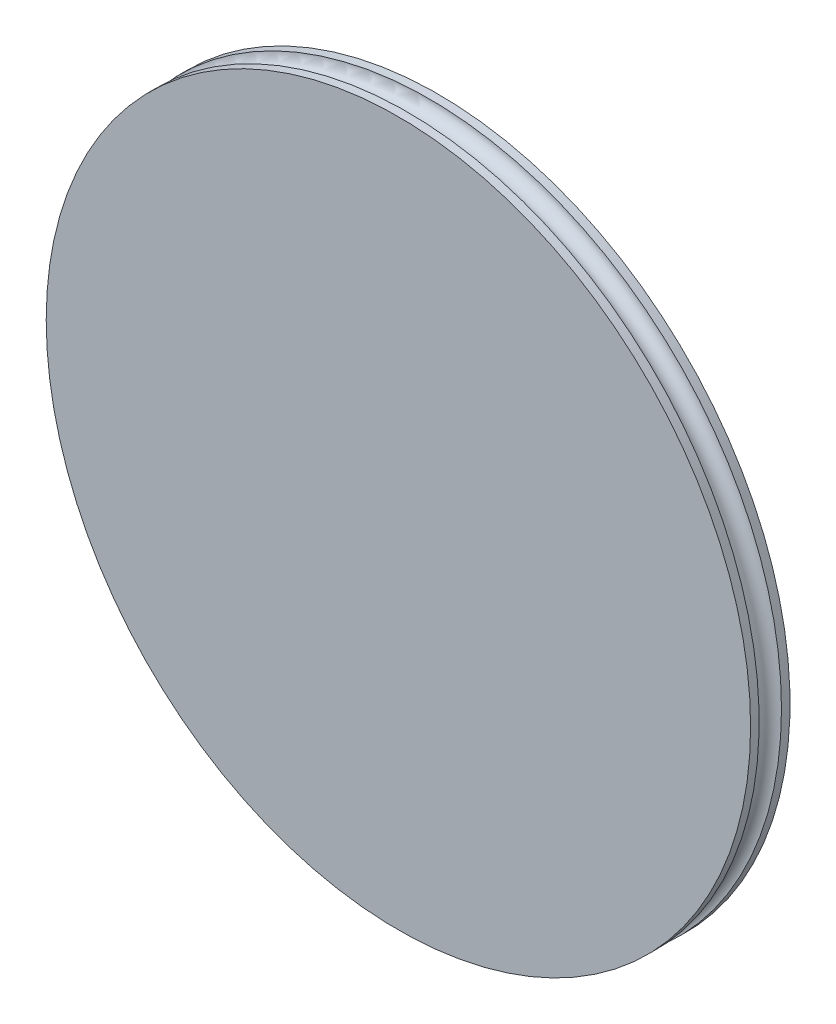
ISO-10303-21;
HEADER;
FILE_DESCRIPTION(('STEP AP214'),'2;1');
FILE_NAME('part.step','',(''),(''),'','','');
FILE_SCHEMA(('AUTOMOTIVE_DESIGN { 1 0 10303 214 1 1 1 1 }'));
ENDSEC;
DATA;
#1=APPLICATION_CONTEXT('core data for automotive mechanical design processes');
#2=APPLICATION_PROTOCOL_DEFINITION('international standard','automotive_design',2000,#1);
#3=PRODUCT_CONTEXT('',#1,'mechanical');
#4=PRODUCT('Part','Part','',(#3));
#5=PRODUCT_RELATED_PRODUCT_CATEGORY('part','',(#4));
#6=PRODUCT_DEFINITION_FORMATION('','',#4);
#7=PRODUCT_DEFINITION_CONTEXT('part definition',#1,'design');
#8=PRODUCT_DEFINITION('design','',#6,#7);
#9=PRODUCT_DEFINITION_SHAPE('','',#8);
#10=(LENGTH_UNIT() NAMED_UNIT(*) SI_UNIT(.MILLI.,.METRE.));
#11=(NAMED_UNIT(*) PLANE_ANGLE_UNIT() SI_UNIT($,.RADIAN.));
#12=(NAMED_UNIT(*) SI_UNIT($,.STERADIAN.) SOLID_ANGLE_UNIT());
#13=UNCERTAINTY_MEASURE_WITH_UNIT(LENGTH_MEASURE(1.E-05),#10,'distance_accuracy_value','');
#14=(GEOMETRIC_REPRESENTATION_CONTEXT(3) GLOBAL_UNCERTAINTY_ASSIGNED_CONTEXT((#13)) GLOBAL_UNIT_ASSIGNED_CONTEXT((#10,
#11,#12)) REPRESENTATION_CONTEXT('',''));
#15=CARTESIAN_POINT('',(0.,0.,0.));
#16=DIRECTION('',(0.,0.,1.));
#17=DIRECTION('',(1.,0.,0.));
#18=AXIS2_PLACEMENT_3D('',#15,#16,#17);
#19=CARTESIAN_POINT('',(0.,0.,12.5));
#20=DIRECTION('',(0.,0.,-1.));
#21=DIRECTION('',(-1.,0.,0.));
#22=AXIS2_PLACEMENT_3D('',#19,#20,#21);
#23=CYLINDRICAL_SURFACE('',#22,26.8);
#24=CARTESIAN_POINT('',(0.,0.,9.5));
#25=DIRECTION('',(0.,0.,-1.));
#26=DIRECTION('',(-1.,0.,0.));
#27=AXIS2_PLACEMENT_3D('',#24,#25,#26);
#28=CIRCLE('',#27,26.8);
#29=CARTESIAN_POINT('',(-26.8,0.,9.5));
#30=VERTEX_POINT('',#29);
#31=EDGE_CURVE('E153',#30,#30,#28,.T.);
#32=ORIENTED_EDGE('',*,*,#31,.F.);
#33=EDGE_LOOP('',(#32));
#34=FACE_BOUND('',#33,.T.);
#35=CARTESIAN_POINT('',(0.,0.,10.15));
#36=DIRECTION('',(0.,0.,1.));
#37=DIRECTION('',(1.,0.,0.));
#38=AXIS2_PLACEMENT_3D('',#35,#36,#37);
#39=CIRCLE('',#38,26.8);
#40=CARTESIAN_POINT('',(26.8,0.,10.15));
#41=VERTEX_POINT('',#40);
#42=EDGE_CURVE('E135',#41,#41,#39,.T.);
#43=ORIENTED_EDGE('',*,*,#42,.F.);
#44=EDGE_LOOP('',(#43));
#45=FACE_BOUND('',#44,.T.);
#46=ADVANCED_FACE('F45',(#34,#45),#23,.T.);
#47=CARTESIAN_POINT('',(0.,0.,11.));
#48=DIRECTION('',(0.,0.,1.));
#49=DIRECTION('',(1.,0.,0.));
#50=AXIS2_PLACEMENT_3D('',#47,#48,#49);
#51=PLANE('',#50);
#52=CARTESIAN_POINT('',(0.,0.,11.));
#53=DIRECTION('',(0.,0.,1.));
#54=DIRECTION('',(1.,0.,0.));
#55=AXIS2_PLACEMENT_3D('',#52,#53,#54);
#56=CIRCLE('',#55,5.75);
#57=CARTESIAN_POINT('',(5.75,0.,11.));
#58=VERTEX_POINT('',#57);
#59=EDGE_CURVE('E107',#58,#58,#56,.T.);
#60=ORIENTED_EDGE('',*,*,#59,.T.);
#61=EDGE_LOOP('',(#60));
#62=FACE_BOUND('',#61,.T.);
#63=CARTESIAN_POINT('',(0.,0.,11.));
#64=DIRECTION('',(0.,0.,-1.));
#65=DIRECTION('',(-1.,0.,0.));
#66=AXIS2_PLACEMENT_3D('',#63,#64,#65);
#67=CIRCLE('',#66,24.8);
#68=CARTESIAN_POINT('',(-24.8,0.,11.));
#69=VERTEX_POINT('',#68);
#70=EDGE_CURVE('E142',#69,#69,#67,.T.);
#71=ORIENTED_EDGE('',*,*,#70,.T.);
#72=EDGE_LOOP('',(#71));
#73=FACE_BOUND('',#72,.T.);
#74=ADVANCED_FACE('F177',(#62,#73),#51,.F.);
#75=CARTESIAN_POINT('',(0.,0.,11.));
#76=DIRECTION('',(0.,0.,-1.));
#77=DIRECTION('',(-1.,0.,0.));
#78=AXIS2_PLACEMENT_3D('',#75,#76,#77);
#79=CYLINDRICAL_SURFACE('',#78,2.83);
#80=CARTESIAN_POINT('',(0.,0.,0.));
#81=DIRECTION('',(0.,0.,1.));
#82=DIRECTION('',(1.,0.,0.));
#83=AXIS2_PLACEMENT_3D('',#80,#81,#82);
#84=CIRCLE('',#83,2.83);
#85=CARTESIAN_POINT('',(2.00222376371873,-2.,0.));
#86=VERTEX_POINT('',#85);
#87=CARTESIAN_POINT('',(2.00222376371873,2.,0.));
#88=VERTEX_POINT('',#87);
#89=EDGE_CURVE('E118',#86,#88,#84,.T.);
#90=ORIENTED_EDGE('',*,*,#89,.F.);
#91=DIRECTION('',(0.,0.,-1.));
#92=VECTOR('',#91,1.);
#93=CARTESIAN_POINT('',(2.00222376371873,-2.,11.));
#94=LINE('',#93,#92);
#95=CARTESIAN_POINT('',(2.00222376371873,-2.,11.));
#96=VERTEX_POINT('',#95);
#97=EDGE_CURVE('E11',#96,#86,#94,.T.);
#98=ORIENTED_EDGE('',*,*,#97,.F.);
#99=CARTESIAN_POINT('',(0.,0.,11.));
#100=DIRECTION('',(0.,0.,1.));
#101=DIRECTION('',(1.,0.,0.));
#102=AXIS2_PLACEMENT_3D('',#99,#100,#101);
#103=CIRCLE('',#102,2.83);
#104=CARTESIAN_POINT('',(2.00222376371873,2.,11.));
#105=VERTEX_POINT('',#104);
#106=EDGE_CURVE('E91',#96,#105,#103,.T.);
#107=ORIENTED_EDGE('',*,*,#106,.T.);
#108=DIRECTION('',(0.,0.,-1.));
#109=VECTOR('',#108,1.);
#110=CARTESIAN_POINT('',(2.00222376371873,2.,11.));
#111=LINE('',#110,#109);
#112=EDGE_CURVE('E86',#105,#88,#111,.T.);
#113=ORIENTED_EDGE('',*,*,#112,.T.);
#114=EDGE_LOOP('',(#90,#98,#107,#113));
#115=FACE_BOUND('',#114,.T.);
#116=ADVANCED_FACE('F92',(#115),#79,.F.);
#117=CARTESIAN_POINT('',(0.,-2.,11.));
#118=DIRECTION('',(0.,1.,0.));
#119=DIRECTION('',(0.,0.,1.));
#120=AXIS2_PLACEMENT_3D('',#117,#118,#119);
#121=PLANE('',#120);
#122=DIRECTION('',(1.,0.,0.));
#123=VECTOR('',#122,1.);
#124=CARTESIAN_POINT('',(0.,-2.,0.));
#125=LINE('',#124,#123);
#126=CARTESIAN_POINT('',(-2.00222376371873,-2.,0.));
#127=VERTEX_POINT('',#126);
#128=EDGE_CURVE('E121',#127,#86,#125,.T.);
#129=ORIENTED_EDGE('',*,*,#128,.F.);
#130=DIRECTION('',(0.,0.,-1.));
#131=VECTOR('',#130,1.);
#132=CARTESIAN_POINT('',(-2.00222376371873,-2.,11.));
#133=LINE('',#132,#131);
#134=CARTESIAN_POINT('',(-2.00222376371873,-2.,11.));
#135=VERTEX_POINT('',#134);
#136=EDGE_CURVE('E56',#135,#127,#133,.T.);
#137=ORIENTED_EDGE('',*,*,#136,.F.);
#138=DIRECTION('',(1.,0.,0.));
#139=VECTOR('',#138,1.);
#140=CARTESIAN_POINT('',(0.,-2.,11.));
#141=LINE('',#140,#139);
#142=EDGE_CURVE('E97',#135,#96,#141,.T.);
#143=ORIENTED_EDGE('',*,*,#142,.T.);
#144=ORIENTED_EDGE('',*,*,#97,.T.);
#145=EDGE_LOOP('',(#129,#137,#143,#144));
#146=FACE_BOUND('',#145,.T.);
#147=ADVANCED_FACE('F47',(#146),#121,.T.);
#148=CARTESIAN_POINT('',(-2.00222376371873,2.,0.));
#149=VERTEX_POINT('',#148);
#150=EDGE_CURVE('E123',#149,#127,#84,.T.);
#151=ORIENTED_EDGE('',*,*,#150,.F.);
#152=DIRECTION('',(0.,0.,-1.));
#153=VECTOR('',#152,1.);
#154=CARTESIAN_POINT('',(-2.00222376371873,2.,11.));
#155=LINE('',#154,#153);
#156=CARTESIAN_POINT('',(-2.00222376371873,2.,11.));
#157=VERTEX_POINT('',#156);
#158=EDGE_CURVE('E65',#157,#149,#155,.T.);
#159=ORIENTED_EDGE('',*,*,#158,.F.);
#160=EDGE_CURVE('E100',#157,#135,#103,.T.);
#161=ORIENTED_EDGE('',*,*,#160,.T.);
#162=ORIENTED_EDGE('',*,*,#136,.T.);
#163=EDGE_LOOP('',(#151,#159,#161,#162));
#164=FACE_BOUND('',#163,.T.);
#165=ADVANCED_FACE('F275',(#164),#79,.F.);
#166=CARTESIAN_POINT('',(0.,2.,11.));
#167=DIRECTION('',(0.,1.,0.));
#168=DIRECTION('',(0.,0.,1.));
#169=AXIS2_PLACEMENT_3D('',#166,#167,#168);
#170=PLANE('',#169);
#171=DIRECTION('',(1.,0.,0.));
#172=VECTOR('',#171,1.);
#173=CARTESIAN_POINT('',(0.,2.,0.));
#174=LINE('',#173,#172);
#175=EDGE_CURVE('E104',#149,#88,#174,.T.);
#176=ORIENTED_EDGE('',*,*,#175,.T.);
#177=ORIENTED_EDGE('',*,*,#112,.F.);
#178=DIRECTION('',(1.,0.,0.));
#179=VECTOR('',#178,1.);
#180=CARTESIAN_POINT('',(0.,2.,11.));
#181=LINE('',#180,#179);
#182=EDGE_CURVE('E102',#157,#105,#181,.T.);
#183=ORIENTED_EDGE('',*,*,#182,.F.);
#184=ORIENTED_EDGE('',*,*,#158,.T.);
#185=EDGE_LOOP('',(#176,#177,#183,#184));
#186=FACE_BOUND('',#185,.T.);
#187=ADVANCED_FACE('F101',(#186),#170,.F.);
#188=CARTESIAN_POINT('',(0.,0.,11.));
#189=DIRECTION('',(0.,0.,-1.));
#190=DIRECTION('',(-1.,0.,0.));
#191=AXIS2_PLACEMENT_3D('',#188,#189,#190);
#192=CYLINDRICAL_SURFACE('',#191,5.75);
#193=ORIENTED_EDGE('',*,*,#59,.F.);
#194=EDGE_LOOP('',(#193));
#195=FACE_BOUND('',#194,.T.);
#196=CARTESIAN_POINT('',(0.,0.,0.));
#197=DIRECTION('',(0.,0.,1.));
#198=DIRECTION('',(1.,0.,0.));
#199=AXIS2_PLACEMENT_3D('',#196,#197,#198);
#200=CIRCLE('',#199,5.75);
#201=CARTESIAN_POINT('',(5.75,0.,0.));
#202=VERTEX_POINT('',#201);
#203=EDGE_CURVE('E98',#202,#202,#200,.T.);
#204=ORIENTED_EDGE('',*,*,#203,.T.);
#205=EDGE_LOOP('',(#204));
#206=FACE_BOUND('',#205,.T.);
#207=ADVANCED_FACE('F290',(#195,#206),#192,.T.);
#208=CARTESIAN_POINT('',(0.,0.,0.));
#209=DIRECTION('',(0.,0.,1.));
#210=DIRECTION('',(1.,0.,0.));
#211=AXIS2_PLACEMENT_3D('',#208,#209,#210);
#212=PLANE('',#211);
#213=ORIENTED_EDGE('',*,*,#89,.T.);
#214=ORIENTED_EDGE('',*,*,#175,.F.);
#215=ORIENTED_EDGE('',*,*,#150,.T.);
#216=ORIENTED_EDGE('',*,*,#128,.T.);
#217=EDGE_LOOP('',(#213,#214,#215,#216));
#218=FACE_BOUND('',#217,.T.);
#219=ORIENTED_EDGE('',*,*,#203,.F.);
#220=EDGE_LOOP('',(#219));
#221=FACE_BOUND('',#220,.T.);
#222=ADVANCED_FACE('F222',(#218,#221),#212,.F.);
#223=ORIENTED_EDGE('',*,*,#106,.F.);
#224=ORIENTED_EDGE('',*,*,#142,.F.);
#225=ORIENTED_EDGE('',*,*,#160,.F.);
#226=ORIENTED_EDGE('',*,*,#182,.T.);
#227=EDGE_LOOP('',(#223,#224,#225,#226));
#228=FACE_BOUND('',#227,.T.);
#229=ADVANCED_FACE('F109',(#228),#51,.F.);
#230=CARTESIAN_POINT('',(0.,0.,9.5));
#231=DIRECTION('',(0.,0.,-1.));
#232=DIRECTION('',(-1.,0.,0.));
#233=AXIS2_PLACEMENT_3D('',#230,#231,#232);
#234=PLANE('',#233);
#235=ORIENTED_EDGE('',*,*,#31,.T.);
#236=EDGE_LOOP('',(#235));
#237=FACE_BOUND('',#236,.T.);
#238=CARTESIAN_POINT('',(0.,0.,9.5));
#239=DIRECTION('',(0.,0.,-1.));
#240=DIRECTION('',(-1.,0.,0.));
#241=AXIS2_PLACEMENT_3D('',#238,#239,#240);
#242=CIRCLE('',#241,24.8);
#243=CARTESIAN_POINT('',(-24.8,0.,9.5));
#244=VERTEX_POINT('',#243);
#245=EDGE_CURVE('E147',#244,#244,#242,.T.);
#246=ORIENTED_EDGE('',*,*,#245,.F.);
#247=EDGE_LOOP('',(#246));
#248=FACE_BOUND('',#247,.T.);
#249=ADVANCED_FACE('F186',(#237,#248),#234,.T.);
#250=CARTESIAN_POINT('',(0.,0.,9.5));
#251=DIRECTION('',(0.,0.,1.));
#252=DIRECTION('',(1.,0.,0.));
#253=AXIS2_PLACEMENT_3D('',#250,#251,#252);
#254=CYLINDRICAL_SURFACE('',#253,24.8);
#255=ORIENTED_EDGE('',*,*,#245,.T.);
#256=EDGE_LOOP('',(#255));
#257=FACE_BOUND('',#256,.T.);
#258=ORIENTED_EDGE('',*,*,#70,.F.);
#259=EDGE_LOOP('',(#258));
#260=FACE_BOUND('',#259,.T.);
#261=ADVANCED_FACE('F189',(#257,#260),#254,.F.);
#262=CARTESIAN_POINT('',(0.,0.,11.));
#263=DIRECTION('',(0.,0.,1.));
#264=DIRECTION('',(1.,0.,0.));
#265=AXIS2_PLACEMENT_3D('',#262,#263,#264);
#266=TOROIDAL_SURFACE('',#265,26.8,0.85);
#267=ORIENTED_EDGE('',*,*,#42,.T.);
#268=EDGE_LOOP('',(#267));
#269=FACE_BOUND('',#268,.T.);
#270=CARTESIAN_POINT('',(0.,0.,11.85));
#271=DIRECTION('',(0.,0.,-1.));
#272=DIRECTION('',(-1.,0.,0.));
#273=AXIS2_PLACEMENT_3D('',#270,#271,#272);
#274=CIRCLE('',#273,26.8);
#275=CARTESIAN_POINT('',(-26.8,0.,11.85));
#276=VERTEX_POINT('',#275);
#277=EDGE_CURVE('E49',#276,#276,#274,.T.);
#278=ORIENTED_EDGE('',*,*,#277,.T.);
#279=EDGE_LOOP('',(#278));
#280=FACE_BOUND('',#279,.T.);
#281=ADVANCED_FACE('F172',(#269,#280),#266,.F.);
#282=CARTESIAN_POINT('',(0.,0.,12.5));
#283=DIRECTION('',(0.,0.,1.));
#284=DIRECTION('',(1.,0.,0.));
#285=AXIS2_PLACEMENT_3D('',#282,#283,#284);
#286=PLANE('',#285);
#287=CARTESIAN_POINT('',(0.,0.,12.5));
#288=DIRECTION('',(0.,0.,1.));
#289=DIRECTION('',(1.,0.,0.));
#290=AXIS2_PLACEMENT_3D('',#287,#288,#289);
#291=CIRCLE('',#290,26.8);
#292=CARTESIAN_POINT('',(26.8,0.,12.5));
#293=VERTEX_POINT('',#292);
#294=EDGE_CURVE('E122',#293,#293,#291,.T.);
#295=ORIENTED_EDGE('',*,*,#294,.T.);
#296=EDGE_LOOP('',(#295));
#297=FACE_BOUND('',#296,.T.);
#298=ADVANCED_FACE('F163',(#297),#286,.T.);
#299=ORIENTED_EDGE('',*,*,#294,.F.);
#300=EDGE_LOOP('',(#299));
#301=FACE_BOUND('',#300,.T.);
#302=ORIENTED_EDGE('',*,*,#277,.F.);
#303=EDGE_LOOP('',(#302));
#304=FACE_BOUND('',#303,.T.);
#305=ADVANCED_FACE('F165',(#301,#304),#23,.T.);
#306=CLOSED_SHELL('',(#46,#74,#116,#147,#165,#187,#207,#222,#229,#249,#261,#281,#298,#305));
#307=MANIFOLD_SOLID_BREP('B2',#306);
#308=ADVANCED_BREP_SHAPE_REPRESENTATION('',(#18,#307),#14);
#309=SHAPE_DEFINITION_REPRESENTATION(#9,#308);
ENDSEC;
END-ISO-10303-21;
